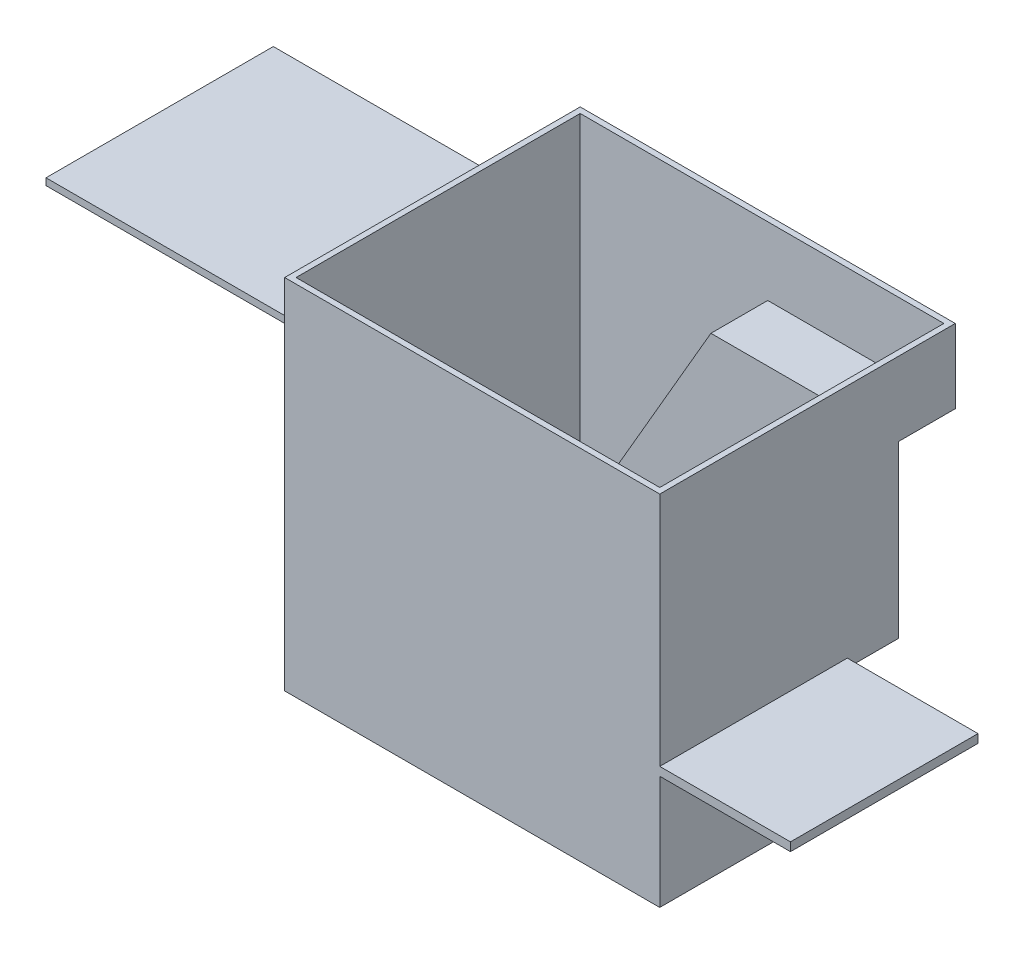
ISO-10303-21;
HEADER;
FILE_DESCRIPTION(('STEP AP214'),'2;1');
FILE_NAME('part.step','',(''),(''),'','','');
FILE_SCHEMA(('AUTOMOTIVE_DESIGN { 1 0 10303 214 1 1 1 1 }'));
ENDSEC;
DATA;
#1=APPLICATION_CONTEXT('core data for automotive mechanical design processes');
#2=APPLICATION_PROTOCOL_DEFINITION('international standard','automotive_design',2000,#1);
#3=PRODUCT_CONTEXT('',#1,'mechanical');
#4=PRODUCT('Part','Part','',(#3));
#5=PRODUCT_RELATED_PRODUCT_CATEGORY('part','',(#4));
#6=PRODUCT_DEFINITION_FORMATION('','',#4);
#7=PRODUCT_DEFINITION_CONTEXT('part definition',#1,'design');
#8=PRODUCT_DEFINITION('design','',#6,#7);
#9=PRODUCT_DEFINITION_SHAPE('','',#8);
#10=(LENGTH_UNIT() NAMED_UNIT(*) SI_UNIT(.MILLI.,.METRE.));
#11=(NAMED_UNIT(*) PLANE_ANGLE_UNIT() SI_UNIT($,.RADIAN.));
#12=(NAMED_UNIT(*) SI_UNIT($,.STERADIAN.) SOLID_ANGLE_UNIT());
#13=UNCERTAINTY_MEASURE_WITH_UNIT(LENGTH_MEASURE(1.E-05),#10,'distance_accuracy_value','');
#14=(GEOMETRIC_REPRESENTATION_CONTEXT(3) GLOBAL_UNCERTAINTY_ASSIGNED_CONTEXT((#13)) GLOBAL_UNIT_ASSIGNED_CONTEXT((#10,
#11,#12)) REPRESENTATION_CONTEXT('',''));
#15=CARTESIAN_POINT('',(0.,0.,0.));
#16=DIRECTION('',(0.,0.,1.));
#17=DIRECTION('',(1.,0.,0.));
#18=AXIS2_PLACEMENT_3D('',#15,#16,#17);
#19=CARTESIAN_POINT('',(770.,0.,0.));
#20=DIRECTION('',(1.,0.,0.));
#21=DIRECTION('',(0.,0.,-1.));
#22=AXIS2_PLACEMENT_3D('',#19,#20,#21);
#23=PLANE('',#22);
#24=DIRECTION('',(0.,0.,1.));
#25=VECTOR('',#24,1.);
#26=CARTESIAN_POINT('',(770.,215.,-320.));
#27=LINE('',#26,#25);
#28=CARTESIAN_POINT('',(770.,215.,-320.));
#29=VERTEX_POINT('',#28);
#30=CARTESIAN_POINT('',(770.,215.,10.));
#31=VERTEX_POINT('',#30);
#32=EDGE_CURVE('E57',#29,#31,#27,.T.);
#33=ORIENTED_EDGE('',*,*,#32,.F.);
#34=DIRECTION('',(0.,1.,0.));
#35=VECTOR('',#34,1.);
#36=CARTESIAN_POINT('',(770.,200.,-320.));
#37=LINE('',#36,#35);
#38=CARTESIAN_POINT('',(770.,200.,-320.));
#39=VERTEX_POINT('',#38);
#40=EDGE_CURVE('E517',#39,#29,#37,.T.);
#41=ORIENTED_EDGE('',*,*,#40,.F.);
#42=DIRECTION('',(0.,0.,-1.));
#43=VECTOR('',#42,1.);
#44=CARTESIAN_POINT('',(770.,200.,-320.));
#45=LINE('',#44,#43);
#46=CARTESIAN_POINT('',(770.,200.,-410.));
#47=VERTEX_POINT('',#46);
#48=EDGE_CURVE('E333',#39,#47,#45,.T.);
#49=ORIENTED_EDGE('',*,*,#48,.T.);
#50=DIRECTION('',(0.,1.,0.));
#51=VECTOR('',#50,1.);
#52=CARTESIAN_POINT('',(770.,510.,-410.));
#53=LINE('',#52,#51);
#54=CARTESIAN_POINT('',(770.,500.,-410.));
#55=VERTEX_POINT('',#54);
#56=EDGE_CURVE('E336',#47,#55,#53,.T.);
#57=ORIENTED_EDGE('',*,*,#56,.T.);
#58=DIRECTION('',(0.,0.,1.));
#59=VECTOR('',#58,1.);
#60=CARTESIAN_POINT('',(770.,500.,-826.187450552678));
#61=LINE('',#60,#59);
#62=CARTESIAN_POINT('',(770.,500.,-510.));
#63=VERTEX_POINT('',#62);
#64=EDGE_CURVE('E311',#63,#55,#61,.T.);
#65=ORIENTED_EDGE('',*,*,#64,.F.);
#66=DIRECTION('',(0.,1.,0.));
#67=VECTOR('',#66,1.);
#68=CARTESIAN_POINT('',(770.,500.,-510.));
#69=LINE('',#68,#67);
#70=CARTESIAN_POINT('',(770.,630.,-510.));
#71=VERTEX_POINT('',#70);
#72=EDGE_CURVE('E310',#63,#71,#69,.T.);
#73=ORIENTED_EDGE('',*,*,#72,.T.);
#74=DIRECTION('',(0.,0.,-1.));
#75=VECTOR('',#74,1.);
#76=CARTESIAN_POINT('',(770.,630.,-510.));
#77=LINE('',#76,#75);
#78=CARTESIAN_POINT('',(770.,630.,10.));
#79=VERTEX_POINT('',#78);
#80=EDGE_CURVE('E300',#79,#71,#77,.T.);
#81=ORIENTED_EDGE('',*,*,#80,.F.);
#82=DIRECTION('',(0.,-1.,0.));
#83=VECTOR('',#82,1.);
#84=CARTESIAN_POINT('',(770.,510.,10.));
#85=LINE('',#84,#83);
#86=EDGE_CURVE('E326',#79,#31,#85,.T.);
#87=ORIENTED_EDGE('',*,*,#86,.T.);
#88=EDGE_LOOP('',(#33,#41,#49,#57,#65,#73,#81,#87));
#89=FACE_BOUND('',#88,.T.);
#90=ADVANCED_FACE('F41',(#89),#23,.T.);
#91=CARTESIAN_POINT('',(110.,0.,0.));
#92=DIRECTION('',(-1.,0.,0.));
#93=DIRECTION('',(0.,0.,1.));
#94=AXIS2_PLACEMENT_3D('',#91,#92,#93);
#95=PLANE('',#94);
#96=DIRECTION('',(0.,-1.,0.));
#97=VECTOR('',#96,1.);
#98=CARTESIAN_POINT('',(110.,510.,-510.));
#99=LINE('',#98,#97);
#100=CARTESIAN_POINT('',(110.,630.,-510.));
#101=VERTEX_POINT('',#100);
#102=CARTESIAN_POINT('',(110.,0.,-510.));
#103=VERTEX_POINT('',#102);
#104=EDGE_CURVE('E313',#101,#103,#99,.T.);
#105=ORIENTED_EDGE('',*,*,#104,.T.);
#106=DIRECTION('',(0.,0.,1.));
#107=VECTOR('',#106,1.);
#108=CARTESIAN_POINT('',(110.,0.,-510.));
#109=LINE('',#108,#107);
#110=CARTESIAN_POINT('',(110.,0.,10.));
#111=VERTEX_POINT('',#110);
#112=EDGE_CURVE('E321',#103,#111,#109,.T.);
#113=ORIENTED_EDGE('',*,*,#112,.T.);
#114=DIRECTION('',(0.,1.,0.));
#115=VECTOR('',#114,1.);
#116=CARTESIAN_POINT('',(110.,510.,10.));
#117=LINE('',#116,#115);
#118=CARTESIAN_POINT('',(110.,630.,10.));
#119=VERTEX_POINT('',#118);
#120=EDGE_CURVE('E324',#111,#119,#117,.T.);
#121=ORIENTED_EDGE('',*,*,#120,.T.);
#122=DIRECTION('',(0.,0.,1.));
#123=VECTOR('',#122,1.);
#124=CARTESIAN_POINT('',(110.,630.,-510.));
#125=LINE('',#124,#123);
#126=EDGE_CURVE('E294',#101,#119,#125,.T.);
#127=ORIENTED_EDGE('',*,*,#126,.F.);
#128=EDGE_LOOP('',(#105,#113,#121,#127));
#129=FACE_BOUND('',#128,.T.);
#130=DIRECTION('',(0.,0.,1.));
#131=VECTOR('',#130,1.);
#132=CARTESIAN_POINT('',(110.,500.,-450.));
#133=LINE('',#132,#131);
#134=CARTESIAN_POINT('',(110.,500.,-450.));
#135=VERTEX_POINT('',#134);
#136=CARTESIAN_POINT('',(110.,500.,-50.));
#137=VERTEX_POINT('',#136);
#138=EDGE_CURVE('E245',#135,#137,#133,.T.);
#139=ORIENTED_EDGE('',*,*,#138,.F.);
#140=DIRECTION('',(0.,-1.,0.));
#141=VECTOR('',#140,1.);
#142=CARTESIAN_POINT('',(110.,512.,-450.));
#143=LINE('',#142,#141);
#144=CARTESIAN_POINT('',(110.,512.,-450.));
#145=VERTEX_POINT('',#144);
#146=EDGE_CURVE('E242',#145,#135,#143,.T.);
#147=ORIENTED_EDGE('',*,*,#146,.F.);
#148=DIRECTION('',(0.,0.,-1.));
#149=VECTOR('',#148,1.);
#150=CARTESIAN_POINT('',(110.,512.,-450.));
#151=LINE('',#150,#149);
#152=CARTESIAN_POINT('',(110.,512.,-50.));
#153=VERTEX_POINT('',#152);
#154=EDGE_CURVE('E255',#153,#145,#151,.T.);
#155=ORIENTED_EDGE('',*,*,#154,.F.);
#156=DIRECTION('',(0.,1.,0.));
#157=VECTOR('',#156,1.);
#158=CARTESIAN_POINT('',(110.,512.,-50.));
#159=LINE('',#158,#157);
#160=EDGE_CURVE('E263',#137,#153,#159,.T.);
#161=ORIENTED_EDGE('',*,*,#160,.F.);
#162=EDGE_LOOP('',(#139,#147,#155,#161));
#163=FACE_BOUND('',#162,.T.);
#164=ADVANCED_FACE('F468',(#129,#163),#95,.T.);
#165=CARTESIAN_POINT('',(276.003467158925,200.,-410.));
#166=DIRECTION('',(0.,0.,-1.));
#167=DIRECTION('',(-1.,0.,0.));
#168=AXIS2_PLACEMENT_3D('',#165,#166,#167);
#169=PLANE('',#168);
#170=DIRECTION('',(0.501729310838744,0.86502468094574,0.));
#171=VECTOR('',#170,1.);
#172=CARTESIAN_POINT('',(169.762228514648,10.,-410.));
#173=LINE('',#172,#171);
#174=CARTESIAN_POINT('',(279.965522315627,200.,-410.));
#175=VERTEX_POINT('',#174);
#176=CARTESIAN_POINT('',(453.970723054015,500.,-410.));
#177=VERTEX_POINT('',#176);
#178=EDGE_CURVE('E418',#175,#177,#173,.T.);
#179=ORIENTED_EDGE('',*,*,#178,.T.);
#180=DIRECTION('',(-1.,0.,0.));
#181=VECTOR('',#180,1.);
#182=CARTESIAN_POINT('',(453.970723054015,500.,-410.));
#183=LINE('',#182,#181);
#184=EDGE_CURVE('E306',#55,#177,#183,.T.);
#185=ORIENTED_EDGE('',*,*,#184,.F.);
#186=ORIENTED_EDGE('',*,*,#56,.F.);
#187=DIRECTION('',(-1.,0.,0.));
#188=VECTOR('',#187,1.);
#189=CARTESIAN_POINT('',(276.003467158925,200.,-410.));
#190=LINE('',#189,#188);
#191=EDGE_CURVE('E368',#47,#175,#190,.T.);
#192=ORIENTED_EDGE('',*,*,#191,.T.);
#193=EDGE_LOOP('',(#179,#185,#186,#192));
#194=FACE_BOUND('',#193,.T.);
#195=ADVANCED_FACE('F476',(#194),#169,.T.);
#196=CARTESIAN_POINT('',(169.762228514648,10.,-75.2204865429753));
#197=DIRECTION('',(0.86502468094574,-0.501729310838744,0.));
#198=DIRECTION('',(0.501729310838744,0.86502468094574,0.));
#199=AXIS2_PLACEMENT_3D('',#196,#197,#198);
#200=PLANE('',#199);
#201=DIRECTION('',(-0.501729310838744,-0.86502468094574,0.));
#202=VECTOR('',#201,1.);
#203=CARTESIAN_POINT('',(169.762228514648,10.,-510.));
#204=LINE('',#203,#202);
#205=CARTESIAN_POINT('',(453.970723054015,500.,-510.));
#206=VERTEX_POINT('',#205);
#207=CARTESIAN_POINT('',(169.762228514648,10.,-510.));
#208=VERTEX_POINT('',#207);
#209=EDGE_CURVE('E380',#206,#208,#204,.T.);
#210=ORIENTED_EDGE('',*,*,#209,.F.);
#211=DIRECTION('',(0.,0.,1.));
#212=VECTOR('',#211,1.);
#213=CARTESIAN_POINT('',(453.970723054015,500.,-826.187450552678));
#214=LINE('',#213,#212);
#215=EDGE_CURVE('E315',#206,#177,#214,.T.);
#216=ORIENTED_EDGE('',*,*,#215,.T.);
#217=ORIENTED_EDGE('',*,*,#178,.F.);
#218=DIRECTION('',(0.,0.,-1.));
#219=VECTOR('',#218,1.);
#220=CARTESIAN_POINT('',(279.965522315627,200.,-75.2204865429753));
#221=LINE('',#220,#219);
#222=CARTESIAN_POINT('',(279.965522315627,200.,-320.));
#223=VERTEX_POINT('',#222);
#224=EDGE_CURVE('E370',#223,#175,#221,.T.);
#225=ORIENTED_EDGE('',*,*,#224,.F.);
#226=DIRECTION('',(-0.501729310838744,-0.86502468094574,0.));
#227=VECTOR('',#226,1.);
#228=CARTESIAN_POINT('',(169.762228514648,10.,-320.));
#229=LINE('',#228,#227);
#230=CARTESIAN_POINT('',(169.762228514648,10.,-320.));
#231=VERTEX_POINT('',#230);
#232=EDGE_CURVE('E393',#223,#231,#229,.T.);
#233=ORIENTED_EDGE('',*,*,#232,.T.);
#234=DIRECTION('',(0.,0.,-1.));
#235=VECTOR('',#234,1.);
#236=CARTESIAN_POINT('',(169.762228514648,10.,-75.2204865429753));
#237=LINE('',#236,#235);
#238=EDGE_CURVE('E392',#231,#208,#237,.T.);
#239=ORIENTED_EDGE('',*,*,#238,.T.);
#240=EDGE_LOOP('',(#210,#216,#217,#225,#233,#239));
#241=FACE_BOUND('',#240,.T.);
#242=ADVANCED_FACE('F501',(#241),#200,.T.);
#243=CARTESIAN_POINT('',(0.,0.,0.));
#244=DIRECTION('',(0.,-1.,0.));
#245=DIRECTION('',(0.,0.,-1.));
#246=AXIS2_PLACEMENT_3D('',#243,#244,#245);
#247=PLANE('',#246);
#248=DIRECTION('',(-1.,0.,0.));
#249=VECTOR('',#248,1.);
#250=CARTESIAN_POINT('',(160.,0.,-320.));
#251=LINE('',#250,#249);
#252=CARTESIAN_POINT('',(770.,0.,-320.));
#253=VERTEX_POINT('',#252);
#254=CARTESIAN_POINT('',(169.762228514648,0.,-320.));
#255=VERTEX_POINT('',#254);
#256=EDGE_CURVE('E406',#253,#255,#251,.T.);
#257=ORIENTED_EDGE('',*,*,#256,.F.);
#258=DIRECTION('',(0.,0.,-1.));
#259=VECTOR('',#258,1.);
#260=CARTESIAN_POINT('',(770.,0.,10.));
#261=LINE('',#260,#259);
#262=CARTESIAN_POINT('',(770.,0.,10.));
#263=VERTEX_POINT('',#262);
#264=EDGE_CURVE('E328',#263,#253,#261,.T.);
#265=ORIENTED_EDGE('',*,*,#264,.F.);
#266=DIRECTION('',(1.,0.,0.));
#267=VECTOR('',#266,1.);
#268=CARTESIAN_POINT('',(0.,0.,10.));
#269=LINE('',#268,#267);
#270=EDGE_CURVE('E356',#111,#263,#269,.T.);
#271=ORIENTED_EDGE('',*,*,#270,.F.);
#272=ORIENTED_EDGE('',*,*,#112,.F.);
#273=DIRECTION('',(-1.,0.,0.));
#274=VECTOR('',#273,1.);
#275=CARTESIAN_POINT('',(0.,0.,-510.));
#276=LINE('',#275,#274);
#277=CARTESIAN_POINT('',(169.762228514648,0.,-510.));
#278=VERTEX_POINT('',#277);
#279=EDGE_CURVE('E411',#278,#103,#276,.T.);
#280=ORIENTED_EDGE('',*,*,#279,.F.);
#281=DIRECTION('',(0.,0.,-1.));
#282=VECTOR('',#281,1.);
#283=CARTESIAN_POINT('',(169.762228514648,0.,-75.2204865429753));
#284=LINE('',#283,#282);
#285=EDGE_CURVE('E391',#255,#278,#284,.T.);
#286=ORIENTED_EDGE('',*,*,#285,.F.);
#287=EDGE_LOOP('',(#257,#265,#271,#272,#280,#286));
#288=FACE_BOUND('',#287,.T.);
#289=ADVANCED_FACE('F503',(#288),#247,.T.);
#290=CARTESIAN_POINT('',(0.,0.,10.));
#291=DIRECTION('',(0.,0.,1.));
#292=DIRECTION('',(1.,0.,0.));
#293=AXIS2_PLACEMENT_3D('',#290,#291,#292);
#294=PLANE('',#293);
#295=ORIENTED_EDGE('',*,*,#270,.T.);
#296=CARTESIAN_POINT('',(770.,200.,10.));
#297=VERTEX_POINT('',#296);
#298=EDGE_CURVE('E241',#297,#263,#85,.T.);
#299=ORIENTED_EDGE('',*,*,#298,.F.);
#300=DIRECTION('',(-1.,0.,0.));
#301=VECTOR('',#300,1.);
#302=CARTESIAN_POINT('',(1000.,200.,10.));
#303=LINE('',#302,#301);
#304=CARTESIAN_POINT('',(1000.,200.,10.));
#305=VERTEX_POINT('',#304);
#306=EDGE_CURVE('E223',#305,#297,#303,.T.);
#307=ORIENTED_EDGE('',*,*,#306,.F.);
#308=DIRECTION('',(0.,-1.,0.));
#309=VECTOR('',#308,1.);
#310=CARTESIAN_POINT('',(1000.,200.,10.));
#311=LINE('',#310,#309);
#312=CARTESIAN_POINT('',(1000.,215.,10.));
#313=VERTEX_POINT('',#312);
#314=EDGE_CURVE('E229',#313,#305,#311,.T.);
#315=ORIENTED_EDGE('',*,*,#314,.F.);
#316=DIRECTION('',(-1.,0.,0.));
#317=VECTOR('',#316,1.);
#318=CARTESIAN_POINT('',(1000.,215.,10.));
#319=LINE('',#318,#317);
#320=EDGE_CURVE('E537',#313,#31,#319,.T.);
#321=ORIENTED_EDGE('',*,*,#320,.T.);
#322=ORIENTED_EDGE('',*,*,#86,.F.);
#323=DIRECTION('',(1.,0.,0.));
#324=VECTOR('',#323,1.);
#325=CARTESIAN_POINT('',(110.,630.,10.));
#326=LINE('',#325,#324);
#327=EDGE_CURVE('E297',#119,#79,#326,.T.);
#328=ORIENTED_EDGE('',*,*,#327,.F.);
#329=ORIENTED_EDGE('',*,*,#120,.F.);
#330=EDGE_LOOP('',(#295,#299,#307,#315,#321,#322,#328,#329));
#331=FACE_BOUND('',#330,.T.);
#332=ADVANCED_FACE('F240',(#331),#294,.T.);
#333=CARTESIAN_POINT('',(160.,10.,-320.));
#334=DIRECTION('',(0.,0.,1.));
#335=DIRECTION('',(1.,0.,0.));
#336=AXIS2_PLACEMENT_3D('',#333,#334,#335);
#337=PLANE('',#336);
#338=DIRECTION('',(1.,0.,0.));
#339=VECTOR('',#338,1.);
#340=CARTESIAN_POINT('',(160.,200.,-320.));
#341=LINE('',#340,#339);
#342=EDGE_CURVE('E373',#223,#39,#341,.T.);
#343=ORIENTED_EDGE('',*,*,#342,.T.);
#344=DIRECTION('',(0.,1.,0.));
#345=VECTOR('',#344,1.);
#346=CARTESIAN_POINT('',(770.,200.,-320.));
#347=LINE('',#346,#345);
#348=EDGE_CURVE('E331',#253,#39,#347,.T.);
#349=ORIENTED_EDGE('',*,*,#348,.F.);
#350=ORIENTED_EDGE('',*,*,#256,.T.);
#351=DIRECTION('',(0.,-1.,0.));
#352=VECTOR('',#351,1.);
#353=CARTESIAN_POINT('',(169.762228514648,0.,-320.));
#354=LINE('',#353,#352);
#355=EDGE_CURVE('E388',#231,#255,#354,.T.);
#356=ORIENTED_EDGE('',*,*,#355,.F.);
#357=ORIENTED_EDGE('',*,*,#232,.F.);
#358=EDGE_LOOP('',(#343,#349,#350,#356,#357));
#359=FACE_BOUND('',#358,.T.);
#360=ADVANCED_FACE('F43',(#359),#337,.F.);
#361=CARTESIAN_POINT('',(0.,200.,0.));
#362=DIRECTION('',(0.,-1.,0.));
#363=DIRECTION('',(0.,0.,-1.));
#364=AXIS2_PLACEMENT_3D('',#361,#362,#363);
#365=PLANE('',#364);
#366=ORIENTED_EDGE('',*,*,#191,.F.);
#367=ORIENTED_EDGE('',*,*,#48,.F.);
#368=ORIENTED_EDGE('',*,*,#342,.F.);
#369=ORIENTED_EDGE('',*,*,#224,.T.);
#370=EDGE_LOOP('',(#366,#367,#368,#369));
#371=FACE_BOUND('',#370,.T.);
#372=ADVANCED_FACE('F497',(#371),#365,.T.);
#373=CARTESIAN_POINT('',(0.,10.,-510.));
#374=DIRECTION('',(0.,0.,1.));
#375=DIRECTION('',(1.,0.,0.));
#376=AXIS2_PLACEMENT_3D('',#373,#374,#375);
#377=PLANE('',#376);
#378=ORIENTED_EDGE('',*,*,#279,.T.);
#379=ORIENTED_EDGE('',*,*,#104,.F.);
#380=DIRECTION('',(-1.,0.,0.));
#381=VECTOR('',#380,1.);
#382=CARTESIAN_POINT('',(110.,630.,-510.));
#383=LINE('',#382,#381);
#384=EDGE_CURVE('E303',#71,#101,#383,.T.);
#385=ORIENTED_EDGE('',*,*,#384,.F.);
#386=ORIENTED_EDGE('',*,*,#72,.F.);
#387=DIRECTION('',(1.,0.,0.));
#388=VECTOR('',#387,1.);
#389=CARTESIAN_POINT('',(453.970723054015,500.,-510.));
#390=LINE('',#389,#388);
#391=EDGE_CURVE('E307',#206,#63,#390,.T.);
#392=ORIENTED_EDGE('',*,*,#391,.F.);
#393=ORIENTED_EDGE('',*,*,#209,.T.);
#394=DIRECTION('',(0.,-1.,0.));
#395=VECTOR('',#394,1.);
#396=CARTESIAN_POINT('',(169.762228514648,0.,-510.));
#397=LINE('',#396,#395);
#398=EDGE_CURVE('E383',#208,#278,#397,.T.);
#399=ORIENTED_EDGE('',*,*,#398,.T.);
#400=EDGE_LOOP('',(#378,#379,#385,#386,#392,#393,#399));
#401=FACE_BOUND('',#400,.T.);
#402=ADVANCED_FACE('F491',(#401),#377,.F.);
#403=CARTESIAN_POINT('',(169.762228514648,0.,-75.2204865429753));
#404=DIRECTION('',(1.,0.,0.));
#405=DIRECTION('',(0.,0.,-1.));
#406=AXIS2_PLACEMENT_3D('',#403,#404,#405);
#407=PLANE('',#406);
#408=ORIENTED_EDGE('',*,*,#238,.F.);
#409=ORIENTED_EDGE('',*,*,#355,.T.);
#410=ORIENTED_EDGE('',*,*,#285,.T.);
#411=ORIENTED_EDGE('',*,*,#398,.F.);
#412=EDGE_LOOP('',(#408,#409,#410,#411));
#413=FACE_BOUND('',#412,.T.);
#414=ADVANCED_FACE('F483',(#413),#407,.T.);
#415=DIRECTION('',(0.,0.,-1.));
#416=VECTOR('',#415,1.);
#417=CARTESIAN_POINT('',(770.,200.,-320.));
#418=LINE('',#417,#416);
#419=EDGE_CURVE('E65',#297,#39,#418,.T.);
#420=ORIENTED_EDGE('',*,*,#419,.F.);
#421=ORIENTED_EDGE('',*,*,#298,.T.);
#422=ORIENTED_EDGE('',*,*,#264,.T.);
#423=ORIENTED_EDGE('',*,*,#348,.T.);
#424=EDGE_LOOP('',(#420,#421,#422,#423));
#425=FACE_BOUND('',#424,.T.);
#426=ADVANCED_FACE('F470',(#425),#23,.T.);
#427=CARTESIAN_POINT('',(453.970723054015,500.,-826.187450552678));
#428=DIRECTION('',(0.,1.,0.));
#429=DIRECTION('',(0.,0.,1.));
#430=AXIS2_PLACEMENT_3D('',#427,#428,#429);
#431=PLANE('',#430);
#432=ORIENTED_EDGE('',*,*,#215,.F.);
#433=ORIENTED_EDGE('',*,*,#391,.T.);
#434=ORIENTED_EDGE('',*,*,#64,.T.);
#435=ORIENTED_EDGE('',*,*,#184,.T.);
#436=EDGE_LOOP('',(#432,#433,#434,#435));
#437=FACE_BOUND('',#436,.T.);
#438=ADVANCED_FACE('F482',(#437),#431,.F.);
#439=CARTESIAN_POINT('',(0.,630.,0.));
#440=DIRECTION('',(0.,1.,0.));
#441=DIRECTION('',(0.,0.,1.));
#442=AXIS2_PLACEMENT_3D('',#439,#440,#441);
#443=PLANE('',#442);
#444=ORIENTED_EDGE('',*,*,#126,.T.);
#445=ORIENTED_EDGE('',*,*,#327,.T.);
#446=ORIENTED_EDGE('',*,*,#80,.T.);
#447=ORIENTED_EDGE('',*,*,#384,.T.);
#448=EDGE_LOOP('',(#444,#445,#446,#447));
#449=FACE_BOUND('',#448,.T.);
#450=DIRECTION('',(1.,0.,0.));
#451=VECTOR('',#450,1.);
#452=CARTESIAN_POINT('',(120.,630.,0.));
#453=LINE('',#452,#451);
#454=CARTESIAN_POINT('',(120.,630.,0.));
#455=VERTEX_POINT('',#454);
#456=CARTESIAN_POINT('',(760.,630.,0.));
#457=VERTEX_POINT('',#456);
#458=EDGE_CURVE('E280',#455,#457,#453,.T.);
#459=ORIENTED_EDGE('',*,*,#458,.F.);
#460=DIRECTION('',(0.,0.,1.));
#461=VECTOR('',#460,1.);
#462=CARTESIAN_POINT('',(120.,630.,-500.));
#463=LINE('',#462,#461);
#464=CARTESIAN_POINT('',(120.,630.,-500.));
#465=VERTEX_POINT('',#464);
#466=EDGE_CURVE('E277',#465,#455,#463,.T.);
#467=ORIENTED_EDGE('',*,*,#466,.F.);
#468=DIRECTION('',(-1.,0.,0.));
#469=VECTOR('',#468,1.);
#470=CARTESIAN_POINT('',(120.,630.,-500.));
#471=LINE('',#470,#469);
#472=CARTESIAN_POINT('',(760.,630.,-500.));
#473=VERTEX_POINT('',#472);
#474=EDGE_CURVE('E286',#473,#465,#471,.T.);
#475=ORIENTED_EDGE('',*,*,#474,.F.);
#476=DIRECTION('',(0.,0.,-1.));
#477=VECTOR('',#476,1.);
#478=CARTESIAN_POINT('',(760.,630.,-500.));
#479=LINE('',#478,#477);
#480=EDGE_CURVE('E283',#457,#473,#479,.T.);
#481=ORIENTED_EDGE('',*,*,#480,.F.);
#482=EDGE_LOOP('',(#459,#467,#475,#481));
#483=FACE_BOUND('',#482,.T.);
#484=ADVANCED_FACE('F463',(#449,#483),#443,.T.);
#485=CARTESIAN_POINT('',(800.,210.,-310.));
#486=DIRECTION('',(0.,0.,-1.));
#487=DIRECTION('',(-1.,0.,0.));
#488=AXIS2_PLACEMENT_3D('',#485,#486,#487);
#489=PLANE('',#488);
#490=DIRECTION('',(0.,-1.,0.));
#491=VECTOR('',#490,1.);
#492=CARTESIAN_POINT('',(760.,210.,-310.));
#493=LINE('',#492,#491);
#494=CARTESIAN_POINT('',(760.,210.,-310.));
#495=VERTEX_POINT('',#494);
#496=CARTESIAN_POINT('',(760.,10.,-310.));
#497=VERTEX_POINT('',#496);
#498=EDGE_CURVE('E341',#495,#497,#493,.T.);
#499=ORIENTED_EDGE('',*,*,#498,.F.);
#500=DIRECTION('',(1.,0.,0.));
#501=VECTOR('',#500,1.);
#502=CARTESIAN_POINT('',(800.,210.,-310.));
#503=LINE('',#502,#501);
#504=CARTESIAN_POINT('',(276.003467158925,210.,-310.));
#505=VERTEX_POINT('',#504);
#506=EDGE_CURVE('E377',#505,#495,#503,.T.);
#507=ORIENTED_EDGE('',*,*,#506,.F.);
#508=DIRECTION('',(-0.501729310838744,-0.86502468094574,0.));
#509=VECTOR('',#508,1.);
#510=CARTESIAN_POINT('',(407.910320272904,437.418811427879,-310.));
#511=LINE('',#510,#509);
#512=CARTESIAN_POINT('',(160.,10.,-310.));
#513=VERTEX_POINT('',#512);
#514=EDGE_CURVE('E414',#505,#513,#511,.T.);
#515=ORIENTED_EDGE('',*,*,#514,.T.);
#516=DIRECTION('',(1.,0.,0.));
#517=VECTOR('',#516,1.);
#518=CARTESIAN_POINT('',(800.,10.,-310.));
#519=LINE('',#518,#517);
#520=EDGE_CURVE('E376',#513,#497,#519,.T.);
#521=ORIENTED_EDGE('',*,*,#520,.T.);
#522=EDGE_LOOP('',(#499,#507,#515,#521));
#523=FACE_BOUND('',#522,.T.);
#524=ADVANCED_FACE('F450',(#523),#489,.F.);
#525=CARTESIAN_POINT('',(285.765695673573,210.,-75.2204865429753));
#526=DIRECTION('',(0.,1.,0.));
#527=DIRECTION('',(0.,0.,1.));
#528=AXIS2_PLACEMENT_3D('',#525,#526,#527);
#529=PLANE('',#528);
#530=ORIENTED_EDGE('',*,*,#506,.T.);
#531=DIRECTION('',(0.,0.,-1.));
#532=VECTOR('',#531,1.);
#533=CARTESIAN_POINT('',(760.,210.,-75.2204865429753));
#534=LINE('',#533,#532);
#535=CARTESIAN_POINT('',(760.,210.,-400.));
#536=VERTEX_POINT('',#535);
#537=EDGE_CURVE('E339',#495,#536,#534,.T.);
#538=ORIENTED_EDGE('',*,*,#537,.T.);
#539=DIRECTION('',(1.,0.,0.));
#540=VECTOR('',#539,1.);
#541=CARTESIAN_POINT('',(800.,210.,-400.));
#542=LINE('',#541,#540);
#543=CARTESIAN_POINT('',(276.003467158925,210.,-400.));
#544=VERTEX_POINT('',#543);
#545=EDGE_CURVE('E358',#544,#536,#542,.T.);
#546=ORIENTED_EDGE('',*,*,#545,.F.);
#547=DIRECTION('',(0.,0.,-1.));
#548=VECTOR('',#547,1.);
#549=CARTESIAN_POINT('',(276.003467158925,210.,-75.2204865429753));
#550=LINE('',#549,#548);
#551=EDGE_CURVE('E386',#505,#544,#550,.T.);
#552=ORIENTED_EDGE('',*,*,#551,.F.);
#553=EDGE_LOOP('',(#530,#538,#546,#552));
#554=FACE_BOUND('',#553,.T.);
#555=ADVANCED_FACE('F453',(#554),#529,.T.);
#556=CARTESIAN_POINT('',(0.,0.,-400.));
#557=DIRECTION('',(0.,0.,1.));
#558=DIRECTION('',(1.,0.,0.));
#559=AXIS2_PLACEMENT_3D('',#556,#557,#558);
#560=PLANE('',#559);
#561=ORIENTED_EDGE('',*,*,#545,.T.);
#562=DIRECTION('',(0.,1.,0.));
#563=VECTOR('',#562,1.);
#564=CARTESIAN_POINT('',(760.,0.,-400.));
#565=LINE('',#564,#563);
#566=CARTESIAN_POINT('',(760.,510.,-400.));
#567=VERTEX_POINT('',#566);
#568=EDGE_CURVE('E45',#536,#567,#565,.T.);
#569=ORIENTED_EDGE('',*,*,#568,.T.);
#570=DIRECTION('',(-1.,0.,0.));
#571=VECTOR('',#570,1.);
#572=CARTESIAN_POINT('',(450.008667897313,510.,-400.));
#573=LINE('',#572,#571);
#574=CARTESIAN_POINT('',(450.008667897313,510.,-400.));
#575=VERTEX_POINT('',#574);
#576=EDGE_CURVE('E361',#567,#575,#573,.T.);
#577=ORIENTED_EDGE('',*,*,#576,.T.);
#578=DIRECTION('',(-0.501729310838744,-0.86502468094574,0.));
#579=VECTOR('',#578,1.);
#580=CARTESIAN_POINT('',(276.003467158925,210.,-400.));
#581=LINE('',#580,#579);
#582=EDGE_CURVE('E363',#575,#544,#581,.T.);
#583=ORIENTED_EDGE('',*,*,#582,.T.);
#584=EDGE_LOOP('',(#561,#569,#577,#583));
#585=FACE_BOUND('',#584,.T.);
#586=ADVANCED_FACE('F426',(#585),#560,.T.);
#587=CARTESIAN_POINT('',(0.,510.,0.));
#588=DIRECTION('',(0.,-1.,0.));
#589=DIRECTION('',(0.,0.,-1.));
#590=AXIS2_PLACEMENT_3D('',#587,#588,#589);
#591=PLANE('',#590);
#592=ORIENTED_EDGE('',*,*,#576,.F.);
#593=DIRECTION('',(0.,0.,-1.));
#594=VECTOR('',#593,1.);
#595=CARTESIAN_POINT('',(760.,510.,-500.));
#596=LINE('',#595,#594);
#597=CARTESIAN_POINT('',(760.,510.,-500.));
#598=VERTEX_POINT('',#597);
#599=EDGE_CURVE('E11',#567,#598,#596,.T.);
#600=ORIENTED_EDGE('',*,*,#599,.T.);
#601=DIRECTION('',(-1.,0.,0.));
#602=VECTOR('',#601,1.);
#603=CARTESIAN_POINT('',(120.,510.,-500.));
#604=LINE('',#603,#602);
#605=CARTESIAN_POINT('',(450.008667897313,510.,-500.));
#606=VERTEX_POINT('',#605);
#607=EDGE_CURVE('E276',#598,#606,#604,.T.);
#608=ORIENTED_EDGE('',*,*,#607,.T.);
#609=DIRECTION('',(0.,0.,-1.));
#610=VECTOR('',#609,1.);
#611=CARTESIAN_POINT('',(450.008667897313,510.,-58.1897271905361));
#612=LINE('',#611,#610);
#613=EDGE_CURVE('E366',#575,#606,#612,.T.);
#614=ORIENTED_EDGE('',*,*,#613,.F.);
#615=EDGE_LOOP('',(#592,#600,#608,#614));
#616=FACE_BOUND('',#615,.T.);
#617=ADVANCED_FACE('F432',(#616),#591,.F.);
#618=CARTESIAN_POINT('',(276.003467158925,210.,-75.2204865429753));
#619=DIRECTION('',(-0.86502468094574,0.501729310838744,0.));
#620=DIRECTION('',(-0.501729310838744,-0.86502468094574,0.));
#621=AXIS2_PLACEMENT_3D('',#618,#619,#620);
#622=PLANE('',#621);
#623=ORIENTED_EDGE('',*,*,#551,.T.);
#624=ORIENTED_EDGE('',*,*,#582,.F.);
#625=ORIENTED_EDGE('',*,*,#613,.T.);
#626=DIRECTION('',(-0.501729310838744,-0.86502468094574,0.));
#627=VECTOR('',#626,1.);
#628=CARTESIAN_POINT('',(160.,10.,-500.));
#629=LINE('',#628,#627);
#630=CARTESIAN_POINT('',(160.,10.,-500.));
#631=VERTEX_POINT('',#630);
#632=EDGE_CURVE('E397',#606,#631,#629,.T.);
#633=ORIENTED_EDGE('',*,*,#632,.T.);
#634=DIRECTION('',(0.,0.,-1.));
#635=VECTOR('',#634,1.);
#636=CARTESIAN_POINT('',(160.,10.,-510.));
#637=LINE('',#636,#635);
#638=EDGE_CURVE('E410',#513,#631,#637,.T.);
#639=ORIENTED_EDGE('',*,*,#638,.F.);
#640=ORIENTED_EDGE('',*,*,#514,.F.);
#641=EDGE_LOOP('',(#623,#624,#625,#633,#639,#640));
#642=FACE_BOUND('',#641,.T.);
#643=ADVANCED_FACE('F443',(#642),#622,.T.);
#644=CARTESIAN_POINT('',(0.,10.,0.));
#645=DIRECTION('',(0.,-1.,0.));
#646=DIRECTION('',(0.,0.,-1.));
#647=AXIS2_PLACEMENT_3D('',#644,#645,#646);
#648=PLANE('',#647);
#649=DIRECTION('',(0.,0.,1.));
#650=VECTOR('',#649,1.);
#651=CARTESIAN_POINT('',(760.,10.,0.));
#652=LINE('',#651,#650);
#653=CARTESIAN_POINT('',(760.,10.,0.));
#654=VERTEX_POINT('',#653);
#655=EDGE_CURVE('E344',#497,#654,#652,.T.);
#656=ORIENTED_EDGE('',*,*,#655,.F.);
#657=ORIENTED_EDGE('',*,*,#520,.F.);
#658=ORIENTED_EDGE('',*,*,#638,.T.);
#659=DIRECTION('',(-1.,0.,0.));
#660=VECTOR('',#659,1.);
#661=CARTESIAN_POINT('',(10.,10.,-500.));
#662=LINE('',#661,#660);
#663=CARTESIAN_POINT('',(120.,10.,-500.));
#664=VERTEX_POINT('',#663);
#665=EDGE_CURVE('E403',#631,#664,#662,.T.);
#666=ORIENTED_EDGE('',*,*,#665,.T.);
#667=DIRECTION('',(0.,0.,-1.));
#668=VECTOR('',#667,1.);
#669=CARTESIAN_POINT('',(120.,10.,0.));
#670=LINE('',#669,#668);
#671=CARTESIAN_POINT('',(120.,10.,0.));
#672=VERTEX_POINT('',#671);
#673=EDGE_CURVE('E351',#672,#664,#670,.T.);
#674=ORIENTED_EDGE('',*,*,#673,.F.);
#675=DIRECTION('',(1.,0.,0.));
#676=VECTOR('',#675,1.);
#677=CARTESIAN_POINT('',(0.,10.,0.));
#678=LINE('',#677,#676);
#679=EDGE_CURVE('E407',#672,#654,#678,.T.);
#680=ORIENTED_EDGE('',*,*,#679,.T.);
#681=EDGE_LOOP('',(#656,#657,#658,#666,#674,#680));
#682=FACE_BOUND('',#681,.T.);
#683=ADVANCED_FACE('F447',(#682),#648,.F.);
#684=CARTESIAN_POINT('',(0.,0.,-500.));
#685=DIRECTION('',(0.,0.,1.));
#686=DIRECTION('',(1.,0.,0.));
#687=AXIS2_PLACEMENT_3D('',#684,#685,#686);
#688=PLANE('',#687);
#689=ORIENTED_EDGE('',*,*,#632,.F.);
#690=ORIENTED_EDGE('',*,*,#607,.F.);
#691=DIRECTION('',(0.,-1.,0.));
#692=VECTOR('',#691,1.);
#693=CARTESIAN_POINT('',(760.,630.,-500.));
#694=LINE('',#693,#692);
#695=EDGE_CURVE('E288',#473,#598,#694,.T.);
#696=ORIENTED_EDGE('',*,*,#695,.F.);
#697=ORIENTED_EDGE('',*,*,#474,.T.);
#698=DIRECTION('',(0.,-1.,0.));
#699=VECTOR('',#698,1.);
#700=CARTESIAN_POINT('',(120.,0.,-500.));
#701=LINE('',#700,#699);
#702=EDGE_CURVE('E353',#465,#664,#701,.T.);
#703=ORIENTED_EDGE('',*,*,#702,.T.);
#704=ORIENTED_EDGE('',*,*,#665,.F.);
#705=EDGE_LOOP('',(#689,#690,#696,#697,#703,#704));
#706=FACE_BOUND('',#705,.T.);
#707=ADVANCED_FACE('F440',(#706),#688,.T.);
#708=CARTESIAN_POINT('',(760.,0.,0.));
#709=DIRECTION('',(1.,0.,0.));
#710=DIRECTION('',(0.,0.,-1.));
#711=AXIS2_PLACEMENT_3D('',#708,#709,#710);
#712=PLANE('',#711);
#713=ORIENTED_EDGE('',*,*,#568,.F.);
#714=ORIENTED_EDGE('',*,*,#537,.F.);
#715=ORIENTED_EDGE('',*,*,#498,.T.);
#716=ORIENTED_EDGE('',*,*,#655,.T.);
#717=DIRECTION('',(0.,1.,0.));
#718=VECTOR('',#717,1.);
#719=CARTESIAN_POINT('',(760.,0.,0.));
#720=LINE('',#719,#718);
#721=EDGE_CURVE('E347',#654,#457,#720,.T.);
#722=ORIENTED_EDGE('',*,*,#721,.T.);
#723=ORIENTED_EDGE('',*,*,#480,.T.);
#724=ORIENTED_EDGE('',*,*,#695,.T.);
#725=ORIENTED_EDGE('',*,*,#599,.F.);
#726=EDGE_LOOP('',(#713,#714,#715,#716,#722,#723,#724,#725));
#727=FACE_BOUND('',#726,.T.);
#728=ADVANCED_FACE('F434',(#727),#712,.F.);
#729=CARTESIAN_POINT('',(0.,0.,0.));
#730=DIRECTION('',(0.,0.,1.));
#731=DIRECTION('',(1.,0.,0.));
#732=AXIS2_PLACEMENT_3D('',#729,#730,#731);
#733=PLANE('',#732);
#734=ORIENTED_EDGE('',*,*,#721,.F.);
#735=ORIENTED_EDGE('',*,*,#679,.F.);
#736=DIRECTION('',(0.,-1.,0.));
#737=VECTOR('',#736,1.);
#738=CARTESIAN_POINT('',(120.,0.,0.));
#739=LINE('',#738,#737);
#740=EDGE_CURVE('E349',#455,#672,#739,.T.);
#741=ORIENTED_EDGE('',*,*,#740,.F.);
#742=ORIENTED_EDGE('',*,*,#458,.T.);
#743=EDGE_LOOP('',(#734,#735,#741,#742));
#744=FACE_BOUND('',#743,.T.);
#745=ADVANCED_FACE('F578',(#744),#733,.F.);
#746=CARTESIAN_POINT('',(120.,0.,0.));
#747=DIRECTION('',(-1.,0.,0.));
#748=DIRECTION('',(0.,0.,1.));
#749=AXIS2_PLACEMENT_3D('',#746,#747,#748);
#750=PLANE('',#749);
#751=ORIENTED_EDGE('',*,*,#702,.F.);
#752=ORIENTED_EDGE('',*,*,#466,.T.);
#753=ORIENTED_EDGE('',*,*,#740,.T.);
#754=ORIENTED_EDGE('',*,*,#673,.T.);
#755=EDGE_LOOP('',(#751,#752,#753,#754));
#756=FACE_BOUND('',#755,.T.);
#757=ADVANCED_FACE('F574',(#756),#750,.F.);
#758=CARTESIAN_POINT('',(-370.,512.,-450.));
#759=DIRECTION('',(0.,0.,1.));
#760=DIRECTION('',(1.,0.,0.));
#761=AXIS2_PLACEMENT_3D('',#758,#759,#760);
#762=PLANE('',#761);
#763=ORIENTED_EDGE('',*,*,#146,.T.);
#764=DIRECTION('',(1.,0.,0.));
#765=VECTOR('',#764,1.);
#766=CARTESIAN_POINT('',(-370.,500.,-450.));
#767=LINE('',#766,#765);
#768=CARTESIAN_POINT('',(-370.,500.,-450.));
#769=VERTEX_POINT('',#768);
#770=EDGE_CURVE('E274',#769,#135,#767,.T.);
#771=ORIENTED_EDGE('',*,*,#770,.F.);
#772=DIRECTION('',(0.,-1.,0.));
#773=VECTOR('',#772,1.);
#774=CARTESIAN_POINT('',(-370.,512.,-450.));
#775=LINE('',#774,#773);
#776=CARTESIAN_POINT('',(-370.,512.,-450.));
#777=VERTEX_POINT('',#776);
#778=EDGE_CURVE('E251',#777,#769,#775,.T.);
#779=ORIENTED_EDGE('',*,*,#778,.F.);
#780=DIRECTION('',(1.,0.,0.));
#781=VECTOR('',#780,1.);
#782=CARTESIAN_POINT('',(-370.,512.,-450.));
#783=LINE('',#782,#781);
#784=EDGE_CURVE('E260',#777,#145,#783,.T.);
#785=ORIENTED_EDGE('',*,*,#784,.T.);
#786=EDGE_LOOP('',(#763,#771,#779,#785));
#787=FACE_BOUND('',#786,.T.);
#788=ADVANCED_FACE('F570',(#787),#762,.F.);
#789=CARTESIAN_POINT('',(-370.,500.,-450.));
#790=DIRECTION('',(0.,1.,0.));
#791=DIRECTION('',(0.,0.,1.));
#792=AXIS2_PLACEMENT_3D('',#789,#790,#791);
#793=PLANE('',#792);
#794=ORIENTED_EDGE('',*,*,#138,.T.);
#795=DIRECTION('',(1.,0.,0.));
#796=VECTOR('',#795,1.);
#797=CARTESIAN_POINT('',(-370.,500.,-50.));
#798=LINE('',#797,#796);
#799=CARTESIAN_POINT('',(-370.,500.,-50.));
#800=VERTEX_POINT('',#799);
#801=EDGE_CURVE('E271',#800,#137,#798,.T.);
#802=ORIENTED_EDGE('',*,*,#801,.F.);
#803=DIRECTION('',(0.,0.,1.));
#804=VECTOR('',#803,1.);
#805=CARTESIAN_POINT('',(-370.,500.,-450.));
#806=LINE('',#805,#804);
#807=EDGE_CURVE('E254',#769,#800,#806,.T.);
#808=ORIENTED_EDGE('',*,*,#807,.F.);
#809=ORIENTED_EDGE('',*,*,#770,.T.);
#810=EDGE_LOOP('',(#794,#802,#808,#809));
#811=FACE_BOUND('',#810,.T.);
#812=ADVANCED_FACE('F566',(#811),#793,.F.);
#813=CARTESIAN_POINT('',(-370.,512.,-50.));
#814=DIRECTION('',(0.,0.,-1.));
#815=DIRECTION('',(-1.,0.,0.));
#816=AXIS2_PLACEMENT_3D('',#813,#814,#815);
#817=PLANE('',#816);
#818=ORIENTED_EDGE('',*,*,#160,.T.);
#819=DIRECTION('',(1.,0.,0.));
#820=VECTOR('',#819,1.);
#821=CARTESIAN_POINT('',(-370.,512.,-50.));
#822=LINE('',#821,#820);
#823=CARTESIAN_POINT('',(-370.,512.,-50.));
#824=VERTEX_POINT('',#823);
#825=EDGE_CURVE('E269',#824,#153,#822,.T.);
#826=ORIENTED_EDGE('',*,*,#825,.F.);
#827=DIRECTION('',(0.,1.,0.));
#828=VECTOR('',#827,1.);
#829=CARTESIAN_POINT('',(-370.,512.,-50.));
#830=LINE('',#829,#828);
#831=EDGE_CURVE('E257',#800,#824,#830,.T.);
#832=ORIENTED_EDGE('',*,*,#831,.F.);
#833=ORIENTED_EDGE('',*,*,#801,.T.);
#834=EDGE_LOOP('',(#818,#826,#832,#833));
#835=FACE_BOUND('',#834,.T.);
#836=ADVANCED_FACE('F562',(#835),#817,.F.);
#837=CARTESIAN_POINT('',(-370.,512.,-450.));
#838=DIRECTION('',(0.,-1.,0.));
#839=DIRECTION('',(0.,0.,-1.));
#840=AXIS2_PLACEMENT_3D('',#837,#838,#839);
#841=PLANE('',#840);
#842=ORIENTED_EDGE('',*,*,#154,.T.);
#843=ORIENTED_EDGE('',*,*,#784,.F.);
#844=DIRECTION('',(0.,0.,-1.));
#845=VECTOR('',#844,1.);
#846=CARTESIAN_POINT('',(-370.,512.,-450.));
#847=LINE('',#846,#845);
#848=EDGE_CURVE('E259',#824,#777,#847,.T.);
#849=ORIENTED_EDGE('',*,*,#848,.F.);
#850=ORIENTED_EDGE('',*,*,#825,.T.);
#851=EDGE_LOOP('',(#842,#843,#849,#850));
#852=FACE_BOUND('',#851,.T.);
#853=ADVANCED_FACE('F558',(#852),#841,.F.);
#854=CARTESIAN_POINT('',(-370.,0.,0.));
#855=DIRECTION('',(-1.,0.,0.));
#856=DIRECTION('',(0.,0.,1.));
#857=AXIS2_PLACEMENT_3D('',#854,#855,#856);
#858=PLANE('',#857);
#859=ORIENTED_EDGE('',*,*,#778,.T.);
#860=ORIENTED_EDGE('',*,*,#807,.T.);
#861=ORIENTED_EDGE('',*,*,#831,.T.);
#862=ORIENTED_EDGE('',*,*,#848,.T.);
#863=EDGE_LOOP('',(#859,#860,#861,#862));
#864=FACE_BOUND('',#863,.T.);
#865=ADVANCED_FACE('F553',(#864),#858,.T.);
#866=CARTESIAN_POINT('',(1000.,200.,-320.));
#867=DIRECTION('',(0.,1.,0.));
#868=DIRECTION('',(0.,0.,1.));
#869=AXIS2_PLACEMENT_3D('',#866,#867,#868);
#870=PLANE('',#869);
#871=ORIENTED_EDGE('',*,*,#419,.T.);
#872=DIRECTION('',(-1.,0.,0.));
#873=VECTOR('',#872,1.);
#874=CARTESIAN_POINT('',(1000.,200.,-320.));
#875=LINE('',#874,#873);
#876=CARTESIAN_POINT('',(1000.,200.,-320.));
#877=VERTEX_POINT('',#876);
#878=EDGE_CURVE('E225',#877,#39,#875,.T.);
#879=ORIENTED_EDGE('',*,*,#878,.F.);
#880=DIRECTION('',(0.,0.,-1.));
#881=VECTOR('',#880,1.);
#882=CARTESIAN_POINT('',(1000.,200.,-320.));
#883=LINE('',#882,#881);
#884=EDGE_CURVE('E219',#305,#877,#883,.T.);
#885=ORIENTED_EDGE('',*,*,#884,.F.);
#886=ORIENTED_EDGE('',*,*,#306,.T.);
#887=EDGE_LOOP('',(#871,#879,#885,#886));
#888=FACE_BOUND('',#887,.T.);
#889=ADVANCED_FACE('F221',(#888),#870,.F.);
#890=CARTESIAN_POINT('',(1000.,200.,-320.));
#891=DIRECTION('',(0.,0.,1.));
#892=DIRECTION('',(1.,0.,0.));
#893=AXIS2_PLACEMENT_3D('',#890,#891,#892);
#894=PLANE('',#893);
#895=ORIENTED_EDGE('',*,*,#40,.T.);
#896=DIRECTION('',(-1.,0.,0.));
#897=VECTOR('',#896,1.);
#898=CARTESIAN_POINT('',(1000.,215.,-320.));
#899=LINE('',#898,#897);
#900=CARTESIAN_POINT('',(1000.,215.,-320.));
#901=VERTEX_POINT('',#900);
#902=EDGE_CURVE('E247',#901,#29,#899,.T.);
#903=ORIENTED_EDGE('',*,*,#902,.F.);
#904=DIRECTION('',(0.,1.,0.));
#905=VECTOR('',#904,1.);
#906=CARTESIAN_POINT('',(1000.,200.,-320.));
#907=LINE('',#906,#905);
#908=EDGE_CURVE('E228',#877,#901,#907,.T.);
#909=ORIENTED_EDGE('',*,*,#908,.F.);
#910=ORIENTED_EDGE('',*,*,#878,.T.);
#911=EDGE_LOOP('',(#895,#903,#909,#910));
#912=FACE_BOUND('',#911,.T.);
#913=ADVANCED_FACE('F546',(#912),#894,.F.);
#914=CARTESIAN_POINT('',(1000.,215.,-320.));
#915=DIRECTION('',(0.,-1.,0.));
#916=DIRECTION('',(0.,0.,-1.));
#917=AXIS2_PLACEMENT_3D('',#914,#915,#916);
#918=PLANE('',#917);
#919=ORIENTED_EDGE('',*,*,#32,.T.);
#920=ORIENTED_EDGE('',*,*,#320,.F.);
#921=DIRECTION('',(0.,0.,1.));
#922=VECTOR('',#921,1.);
#923=CARTESIAN_POINT('',(1000.,215.,-320.));
#924=LINE('',#923,#922);
#925=EDGE_CURVE('E234',#901,#313,#924,.T.);
#926=ORIENTED_EDGE('',*,*,#925,.F.);
#927=ORIENTED_EDGE('',*,*,#902,.T.);
#928=EDGE_LOOP('',(#919,#920,#926,#927));
#929=FACE_BOUND('',#928,.T.);
#930=ADVANCED_FACE('F536',(#929),#918,.F.);
#931=CARTESIAN_POINT('',(1000.,0.,0.));
#932=DIRECTION('',(1.,0.,0.));
#933=DIRECTION('',(0.,0.,-1.));
#934=AXIS2_PLACEMENT_3D('',#931,#932,#933);
#935=PLANE('',#934);
#936=ORIENTED_EDGE('',*,*,#314,.T.);
#937=ORIENTED_EDGE('',*,*,#884,.T.);
#938=ORIENTED_EDGE('',*,*,#908,.T.);
#939=ORIENTED_EDGE('',*,*,#925,.T.);
#940=EDGE_LOOP('',(#936,#937,#938,#939));
#941=FACE_BOUND('',#940,.T.);
#942=ADVANCED_FACE('F232',(#941),#935,.T.);
#943=CLOSED_SHELL('',(#90,#164,#195,#242,#289,#332,#360,#372,#402,#414,#426,#438,#484,#524,#555,
#586,#617,#643,#683,#707,#728,#745,#757,#788,#812,#836,#853,#865,#889,#913,#930,#942));
#944=MANIFOLD_SOLID_BREP('B2',#943);
#945=ADVANCED_BREP_SHAPE_REPRESENTATION('',(#18,#944),#14);
#946=SHAPE_DEFINITION_REPRESENTATION(#9,#945);
ENDSEC;
END-ISO-10303-21;
